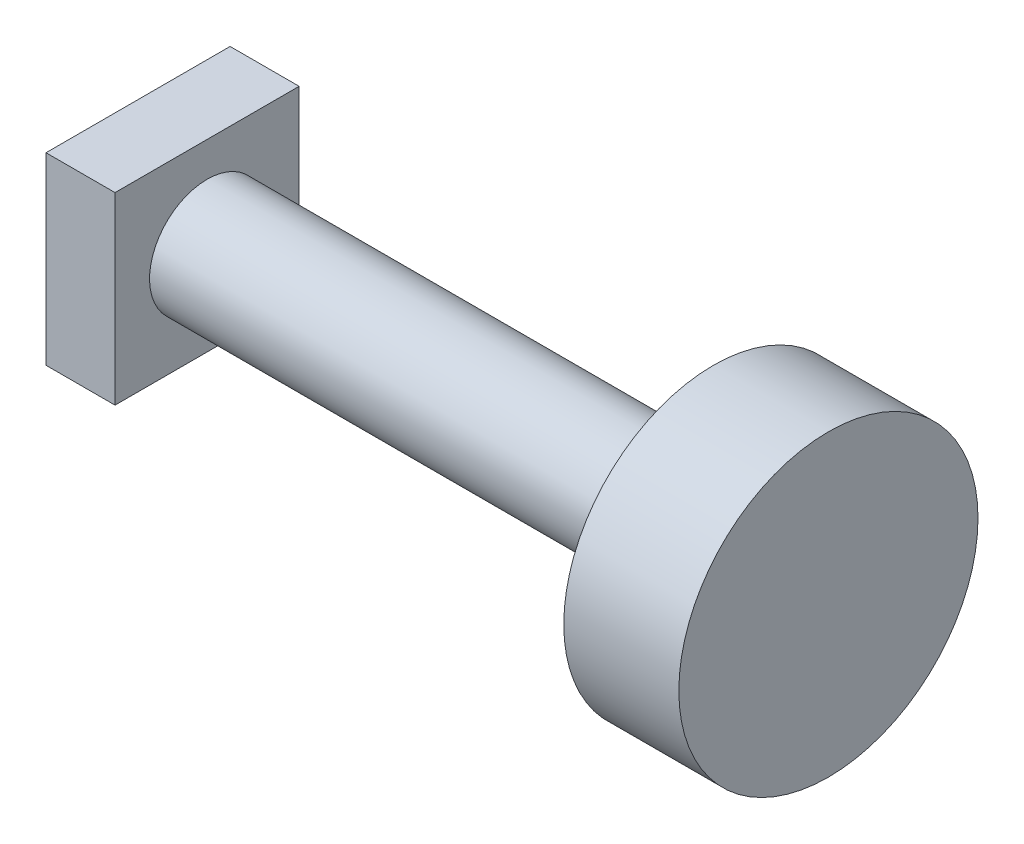
ISO-10303-21;
HEADER;
FILE_DESCRIPTION(('STEP AP214'),'2;1');
FILE_NAME('part.step','',(''),(''),'','','');
FILE_SCHEMA(('AUTOMOTIVE_DESIGN { 1 0 10303 214 1 1 1 1 }'));
ENDSEC;
DATA;
#1=APPLICATION_CONTEXT('core data for automotive mechanical design processes');
#2=APPLICATION_PROTOCOL_DEFINITION('international standard','automotive_design',2000,#1);
#3=PRODUCT_CONTEXT('',#1,'mechanical');
#4=PRODUCT('Part','Part','',(#3));
#5=PRODUCT_RELATED_PRODUCT_CATEGORY('part','',(#4));
#6=PRODUCT_DEFINITION_FORMATION('','',#4);
#7=PRODUCT_DEFINITION_CONTEXT('part definition',#1,'design');
#8=PRODUCT_DEFINITION('design','',#6,#7);
#9=PRODUCT_DEFINITION_SHAPE('','',#8);
#10=(LENGTH_UNIT() NAMED_UNIT(*) SI_UNIT(.MILLI.,.METRE.));
#11=(NAMED_UNIT(*) PLANE_ANGLE_UNIT() SI_UNIT($,.RADIAN.));
#12=(NAMED_UNIT(*) SI_UNIT($,.STERADIAN.) SOLID_ANGLE_UNIT());
#13=UNCERTAINTY_MEASURE_WITH_UNIT(LENGTH_MEASURE(1.E-05),#10,'distance_accuracy_value','');
#14=(GEOMETRIC_REPRESENTATION_CONTEXT(3) GLOBAL_UNCERTAINTY_ASSIGNED_CONTEXT((#13)) GLOBAL_UNIT_ASSIGNED_CONTEXT((#10,
#11,#12)) REPRESENTATION_CONTEXT('',''));
#15=CARTESIAN_POINT('',(0.,0.,0.));
#16=DIRECTION('',(0.,0.,1.));
#17=DIRECTION('',(1.,0.,0.));
#18=AXIS2_PLACEMENT_3D('',#15,#16,#17);
#19=CARTESIAN_POINT('',(30.,0.,0.));
#20=DIRECTION('',(1.,0.,0.));
#21=DIRECTION('',(0.,1.,0.));
#22=AXIS2_PLACEMENT_3D('',#19,#20,#21);
#23=CYLINDRICAL_SURFACE('',#22,2.5);
#24=CARTESIAN_POINT('',(3.,0.,0.));
#25=DIRECTION('',(1.,0.,0.));
#26=DIRECTION('',(0.,0.,-1.));
#27=AXIS2_PLACEMENT_3D('',#24,#25,#26);
#28=CIRCLE('',#27,2.5);
#29=CARTESIAN_POINT('',(3.,0.,-2.5));
#30=VERTEX_POINT('',#29);
#31=EDGE_CURVE('E11',#30,#30,#28,.F.);
#32=ORIENTED_EDGE('',*,*,#31,.F.);
#33=EDGE_LOOP('',(#32));
#34=FACE_BOUND('',#33,.T.);
#35=CARTESIAN_POINT('',(25.,0.,0.));
#36=DIRECTION('',(1.,0.,0.));
#37=DIRECTION('',(0.,1.,0.));
#38=AXIS2_PLACEMENT_3D('',#35,#36,#37);
#39=CIRCLE('',#38,2.5);
#40=CARTESIAN_POINT('',(25.,2.5,0.));
#41=VERTEX_POINT('',#40);
#42=EDGE_CURVE('E44',#41,#41,#39,.T.);
#43=ORIENTED_EDGE('',*,*,#42,.F.);
#44=EDGE_LOOP('',(#43));
#45=FACE_BOUND('',#44,.T.);
#46=ADVANCED_FACE('F35',(#34,#45),#23,.T.);
#47=CARTESIAN_POINT('',(25.,2.5,0.));
#48=DIRECTION('',(-1.,0.,0.));
#49=DIRECTION('',(0.,-1.,0.));
#50=AXIS2_PLACEMENT_3D('',#47,#48,#49);
#51=PLANE('',#50);
#52=ORIENTED_EDGE('',*,*,#42,.T.);
#53=EDGE_LOOP('',(#52));
#54=FACE_BOUND('',#53,.T.);
#55=CARTESIAN_POINT('',(25.,0.,0.));
#56=DIRECTION('',(1.,0.,0.));
#57=DIRECTION('',(0.,1.,0.));
#58=AXIS2_PLACEMENT_3D('',#55,#56,#57);
#59=CIRCLE('',#58,6.5);
#60=CARTESIAN_POINT('',(25.,6.5,0.));
#61=VERTEX_POINT('',#60);
#62=EDGE_CURVE('E117',#61,#61,#59,.T.);
#63=ORIENTED_EDGE('',*,*,#62,.F.);
#64=EDGE_LOOP('',(#63));
#65=FACE_BOUND('',#64,.T.);
#66=ADVANCED_FACE('F122',(#54,#65),#51,.T.);
#67=CARTESIAN_POINT('',(30.,0.,0.));
#68=DIRECTION('',(1.,0.,0.));
#69=DIRECTION('',(0.,1.,0.));
#70=AXIS2_PLACEMENT_3D('',#67,#68,#69);
#71=CYLINDRICAL_SURFACE('',#70,6.5);
#72=ORIENTED_EDGE('',*,*,#62,.T.);
#73=EDGE_LOOP('',(#72));
#74=FACE_BOUND('',#73,.T.);
#75=CARTESIAN_POINT('',(30.,0.,0.));
#76=DIRECTION('',(1.,0.,0.));
#77=DIRECTION('',(0.,1.,0.));
#78=AXIS2_PLACEMENT_3D('',#75,#76,#77);
#79=CIRCLE('',#78,6.5);
#80=CARTESIAN_POINT('',(30.,6.5,0.));
#81=VERTEX_POINT('',#80);
#82=EDGE_CURVE('E112',#81,#81,#79,.T.);
#83=ORIENTED_EDGE('',*,*,#82,.F.);
#84=EDGE_LOOP('',(#83));
#85=FACE_BOUND('',#84,.T.);
#86=ADVANCED_FACE('F130',(#74,#85),#71,.T.);
#87=CARTESIAN_POINT('',(30.,6.5,0.));
#88=DIRECTION('',(1.,0.,0.));
#89=DIRECTION('',(0.,1.,0.));
#90=AXIS2_PLACEMENT_3D('',#87,#88,#89);
#91=PLANE('',#90);
#92=ORIENTED_EDGE('',*,*,#82,.T.);
#93=EDGE_LOOP('',(#92));
#94=FACE_BOUND('',#93,.T.);
#95=ADVANCED_FACE('F136',(#94),#91,.T.);
#96=CARTESIAN_POINT('',(3.,-4.,4.));
#97=DIRECTION('',(0.,0.,1.));
#98=DIRECTION('',(1.,0.,0.));
#99=AXIS2_PLACEMENT_3D('',#96,#97,#98);
#100=PLANE('',#99);
#101=DIRECTION('',(0.,1.,0.));
#102=VECTOR('',#101,1.);
#103=CARTESIAN_POINT('',(0.,-4.,4.));
#104=LINE('',#103,#102);
#105=CARTESIAN_POINT('',(0.,-4.,4.));
#106=VERTEX_POINT('',#105);
#107=CARTESIAN_POINT('',(0.,4.,4.));
#108=VERTEX_POINT('',#107);
#109=EDGE_CURVE('E103',#106,#108,#104,.T.);
#110=ORIENTED_EDGE('',*,*,#109,.F.);
#111=DIRECTION('',(-1.,0.,0.));
#112=VECTOR('',#111,1.);
#113=CARTESIAN_POINT('',(3.,-4.,4.));
#114=LINE('',#113,#112);
#115=CARTESIAN_POINT('',(3.,-4.,4.));
#116=VERTEX_POINT('',#115);
#117=EDGE_CURVE('E52',#116,#106,#114,.T.);
#118=ORIENTED_EDGE('',*,*,#117,.F.);
#119=DIRECTION('',(0.,1.,0.));
#120=VECTOR('',#119,1.);
#121=CARTESIAN_POINT('',(3.,-4.,4.));
#122=LINE('',#121,#120);
#123=CARTESIAN_POINT('',(3.,4.,4.));
#124=VERTEX_POINT('',#123);
#125=EDGE_CURVE('E97',#116,#124,#122,.T.);
#126=ORIENTED_EDGE('',*,*,#125,.T.);
#127=DIRECTION('',(-1.,0.,0.));
#128=VECTOR('',#127,1.);
#129=CARTESIAN_POINT('',(3.,4.,4.));
#130=LINE('',#129,#128);
#131=EDGE_CURVE('E80',#124,#108,#130,.T.);
#132=ORIENTED_EDGE('',*,*,#131,.T.);
#133=EDGE_LOOP('',(#110,#118,#126,#132));
#134=FACE_BOUND('',#133,.T.);
#135=ADVANCED_FACE('F140',(#134),#100,.T.);
#136=CARTESIAN_POINT('',(3.,-4.,-4.));
#137=DIRECTION('',(0.,-1.,0.));
#138=DIRECTION('',(0.,0.,-1.));
#139=AXIS2_PLACEMENT_3D('',#136,#137,#138);
#140=PLANE('',#139);
#141=DIRECTION('',(0.,0.,1.));
#142=VECTOR('',#141,1.);
#143=CARTESIAN_POINT('',(0.,-4.,-4.));
#144=LINE('',#143,#142);
#145=CARTESIAN_POINT('',(0.,-4.,-4.));
#146=VERTEX_POINT('',#145);
#147=EDGE_CURVE('E99',#146,#106,#144,.T.);
#148=ORIENTED_EDGE('',*,*,#147,.F.);
#149=DIRECTION('',(-1.,0.,0.));
#150=VECTOR('',#149,1.);
#151=CARTESIAN_POINT('',(3.,-4.,-4.));
#152=LINE('',#151,#150);
#153=CARTESIAN_POINT('',(3.,-4.,-4.));
#154=VERTEX_POINT('',#153);
#155=EDGE_CURVE('E69',#154,#146,#152,.T.);
#156=ORIENTED_EDGE('',*,*,#155,.F.);
#157=DIRECTION('',(0.,0.,1.));
#158=VECTOR('',#157,1.);
#159=CARTESIAN_POINT('',(3.,-4.,-4.));
#160=LINE('',#159,#158);
#161=EDGE_CURVE('E94',#154,#116,#160,.T.);
#162=ORIENTED_EDGE('',*,*,#161,.T.);
#163=ORIENTED_EDGE('',*,*,#117,.T.);
#164=EDGE_LOOP('',(#148,#156,#162,#163));
#165=FACE_BOUND('',#164,.T.);
#166=ADVANCED_FACE('F144',(#165),#140,.T.);
#167=CARTESIAN_POINT('',(3.,-4.,-4.));
#168=DIRECTION('',(0.,0.,-1.));
#169=DIRECTION('',(-1.,0.,0.));
#170=AXIS2_PLACEMENT_3D('',#167,#168,#169);
#171=PLANE('',#170);
#172=DIRECTION('',(0.,-1.,0.));
#173=VECTOR('',#172,1.);
#174=CARTESIAN_POINT('',(0.,-4.,-4.));
#175=LINE('',#174,#173);
#176=CARTESIAN_POINT('',(0.,4.,-4.));
#177=VERTEX_POINT('',#176);
#178=EDGE_CURVE('E88',#177,#146,#175,.T.);
#179=ORIENTED_EDGE('',*,*,#178,.F.);
#180=DIRECTION('',(-1.,0.,0.));
#181=VECTOR('',#180,1.);
#182=CARTESIAN_POINT('',(3.,4.,-4.));
#183=LINE('',#182,#181);
#184=CARTESIAN_POINT('',(3.,4.,-4.));
#185=VERTEX_POINT('',#184);
#186=EDGE_CURVE('E83',#185,#177,#183,.T.);
#187=ORIENTED_EDGE('',*,*,#186,.F.);
#188=DIRECTION('',(0.,-1.,0.));
#189=VECTOR('',#188,1.);
#190=CARTESIAN_POINT('',(3.,-4.,-4.));
#191=LINE('',#190,#189);
#192=EDGE_CURVE('E86',#185,#154,#191,.T.);
#193=ORIENTED_EDGE('',*,*,#192,.T.);
#194=ORIENTED_EDGE('',*,*,#155,.T.);
#195=EDGE_LOOP('',(#179,#187,#193,#194));
#196=FACE_BOUND('',#195,.T.);
#197=ADVANCED_FACE('F85',(#196),#171,.T.);
#198=CARTESIAN_POINT('',(3.,4.,-4.));
#199=DIRECTION('',(0.,1.,0.));
#200=DIRECTION('',(0.,0.,1.));
#201=AXIS2_PLACEMENT_3D('',#198,#199,#200);
#202=PLANE('',#201);
#203=DIRECTION('',(0.,0.,-1.));
#204=VECTOR('',#203,1.);
#205=CARTESIAN_POINT('',(0.,4.,-4.));
#206=LINE('',#205,#204);
#207=EDGE_CURVE('E106',#108,#177,#206,.T.);
#208=ORIENTED_EDGE('',*,*,#207,.F.);
#209=ORIENTED_EDGE('',*,*,#131,.F.);
#210=DIRECTION('',(0.,0.,-1.));
#211=VECTOR('',#210,1.);
#212=CARTESIAN_POINT('',(3.,4.,-4.));
#213=LINE('',#212,#211);
#214=EDGE_CURVE('E93',#124,#185,#213,.T.);
#215=ORIENTED_EDGE('',*,*,#214,.T.);
#216=ORIENTED_EDGE('',*,*,#186,.T.);
#217=EDGE_LOOP('',(#208,#209,#215,#216));
#218=FACE_BOUND('',#217,.T.);
#219=ADVANCED_FACE('F96',(#218),#202,.T.);
#220=CARTESIAN_POINT('',(3.,0.,0.));
#221=DIRECTION('',(1.,0.,0.));
#222=DIRECTION('',(0.,0.,-1.));
#223=AXIS2_PLACEMENT_3D('',#220,#221,#222);
#224=PLANE('',#223);
#225=ORIENTED_EDGE('',*,*,#31,.T.);
#226=EDGE_LOOP('',(#225));
#227=FACE_BOUND('',#226,.T.);
#228=ORIENTED_EDGE('',*,*,#125,.F.);
#229=ORIENTED_EDGE('',*,*,#161,.F.);
#230=ORIENTED_EDGE('',*,*,#192,.F.);
#231=ORIENTED_EDGE('',*,*,#214,.F.);
#232=EDGE_LOOP('',(#228,#229,#230,#231));
#233=FACE_BOUND('',#232,.T.);
#234=ADVANCED_FACE('F92',(#227,#233),#224,.T.);
#235=CARTESIAN_POINT('',(0.,0.,0.));
#236=DIRECTION('',(-1.,0.,0.));
#237=DIRECTION('',(0.,-1.,0.));
#238=AXIS2_PLACEMENT_3D('',#235,#236,#237);
#239=PLANE('',#238);
#240=ORIENTED_EDGE('',*,*,#109,.T.);
#241=ORIENTED_EDGE('',*,*,#207,.T.);
#242=ORIENTED_EDGE('',*,*,#178,.T.);
#243=ORIENTED_EDGE('',*,*,#147,.T.);
#244=EDGE_LOOP('',(#240,#241,#242,#243));
#245=FACE_BOUND('',#244,.T.);
#246=ADVANCED_FACE('F37',(#245),#239,.T.);
#247=CLOSED_SHELL('',(#46,#66,#86,#95,#135,#166,#197,#219,#234,#246));
#248=MANIFOLD_SOLID_BREP('B2',#247);
#249=ADVANCED_BREP_SHAPE_REPRESENTATION('',(#18,#248),#14);
#250=SHAPE_DEFINITION_REPRESENTATION(#9,#249);
ENDSEC;
END-ISO-10303-21;
